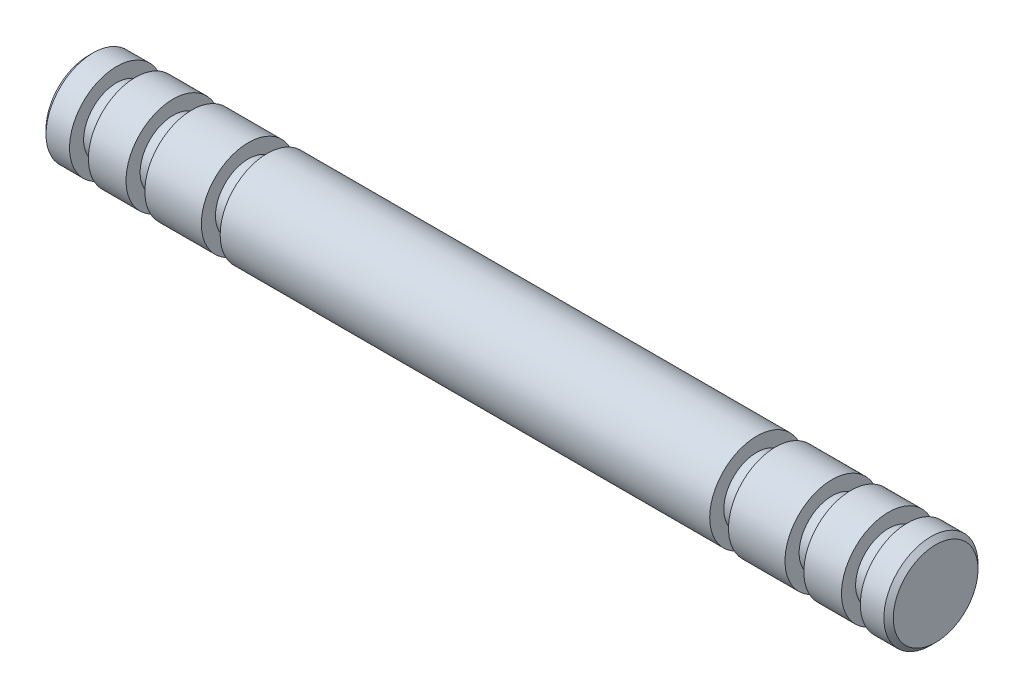
ISO-10303-21;
HEADER;
FILE_DESCRIPTION(('STEP AP214'),'2;1');
FILE_NAME('part.step','',(''),(''),'','','');
FILE_SCHEMA(('AUTOMOTIVE_DESIGN { 1 0 10303 214 1 1 1 1 }'));
ENDSEC;
DATA;
#1=APPLICATION_CONTEXT('core data for automotive mechanical design processes');
#2=APPLICATION_PROTOCOL_DEFINITION('international standard','automotive_design',2000,#1);
#3=PRODUCT_CONTEXT('',#1,'mechanical');
#4=PRODUCT('Part','Part','',(#3));
#5=PRODUCT_RELATED_PRODUCT_CATEGORY('part','',(#4));
#6=PRODUCT_DEFINITION_FORMATION('','',#4);
#7=PRODUCT_DEFINITION_CONTEXT('part definition',#1,'design');
#8=PRODUCT_DEFINITION('design','',#6,#7);
#9=PRODUCT_DEFINITION_SHAPE('','',#8);
#10=(LENGTH_UNIT() NAMED_UNIT(*) SI_UNIT(.MILLI.,.METRE.));
#11=(NAMED_UNIT(*) PLANE_ANGLE_UNIT() SI_UNIT($,.RADIAN.));
#12=(NAMED_UNIT(*) SI_UNIT($,.STERADIAN.) SOLID_ANGLE_UNIT());
#13=UNCERTAINTY_MEASURE_WITH_UNIT(LENGTH_MEASURE(1.E-05),#10,'distance_accuracy_value','');
#14=(GEOMETRIC_REPRESENTATION_CONTEXT(3) GLOBAL_UNCERTAINTY_ASSIGNED_CONTEXT((#13)) GLOBAL_UNIT_ASSIGNED_CONTEXT((#10,
#11,#12)) REPRESENTATION_CONTEXT('',''));
#15=CARTESIAN_POINT('',(0.,0.,0.));
#16=DIRECTION('',(0.,0.,1.));
#17=DIRECTION('',(1.,0.,0.));
#18=AXIS2_PLACEMENT_3D('',#15,#16,#17);
#19=CARTESIAN_POINT('',(-16.,0.,0.));
#20=DIRECTION('',(1.,0.,0.));
#21=DIRECTION('',(0.,0.,-1.));
#22=AXIS2_PLACEMENT_3D('',#19,#20,#21);
#23=CYLINDRICAL_SURFACE('',#22,5.);
#24=CARTESIAN_POINT('',(-18.5,0.,0.));
#25=DIRECTION('',(-1.,0.,0.));
#26=DIRECTION('',(0.,0.,1.));
#27=AXIS2_PLACEMENT_3D('',#24,#25,#26);
#28=CIRCLE('',#27,5.);
#29=CARTESIAN_POINT('',(-18.5,0.,5.));
#30=VERTEX_POINT('',#29);
#31=EDGE_CURVE('E53',#30,#30,#28,.F.);
#32=ORIENTED_EDGE('',*,*,#31,.T.);
#33=EDGE_LOOP('',(#32));
#34=FACE_BOUND('',#33,.T.);
#35=CARTESIAN_POINT('',(-16.,0.,0.));
#36=DIRECTION('',(1.,0.,0.));
#37=DIRECTION('',(0.,0.,-1.));
#38=AXIS2_PLACEMENT_3D('',#35,#36,#37);
#39=CIRCLE('',#38,5.);
#40=CARTESIAN_POINT('',(-16.,0.,-5.));
#41=VERTEX_POINT('',#40);
#42=EDGE_CURVE('E109',#41,#41,#39,.T.);
#43=ORIENTED_EDGE('',*,*,#42,.F.);
#44=EDGE_LOOP('',(#43));
#45=FACE_BOUND('',#44,.T.);
#46=ADVANCED_FACE('F39',(#34,#45),#23,.T.);
#47=CARTESIAN_POINT('',(68.,0.,0.));
#48=DIRECTION('',(-1.,0.,0.));
#49=DIRECTION('',(0.,0.,1.));
#50=AXIS2_PLACEMENT_3D('',#47,#48,#49);
#51=CYLINDRICAL_SURFACE('',#50,5.);
#52=CARTESIAN_POINT('',(70.5,0.,0.));
#53=DIRECTION('',(1.,0.,0.));
#54=DIRECTION('',(0.,0.,-1.));
#55=AXIS2_PLACEMENT_3D('',#52,#53,#54);
#56=CIRCLE('',#55,5.);
#57=CARTESIAN_POINT('',(70.5,0.,-5.));
#58=VERTEX_POINT('',#57);
#59=EDGE_CURVE('E10',#58,#58,#56,.F.);
#60=ORIENTED_EDGE('',*,*,#59,.T.);
#61=EDGE_LOOP('',(#60));
#62=FACE_BOUND('',#61,.T.);
#63=CARTESIAN_POINT('',(68.,0.,0.));
#64=DIRECTION('',(1.,0.,0.));
#65=DIRECTION('',(0.,0.,-1.));
#66=AXIS2_PLACEMENT_3D('',#63,#64,#65);
#67=CIRCLE('',#66,5.);
#68=CARTESIAN_POINT('',(68.,0.,-5.));
#69=VERTEX_POINT('',#68);
#70=EDGE_CURVE('E141',#69,#69,#67,.T.);
#71=ORIENTED_EDGE('',*,*,#70,.T.);
#72=EDGE_LOOP('',(#71));
#73=FACE_BOUND('',#72,.T.);
#74=ADVANCED_FACE('F182',(#62,#73),#51,.T.);
#75=CARTESIAN_POINT('',(52.,0.,0.));
#76=DIRECTION('',(-1.,0.,0.));
#77=DIRECTION('',(0.,0.,1.));
#78=AXIS2_PLACEMENT_3D('',#75,#76,#77);
#79=CYLINDRICAL_SURFACE('',#78,5.);
#80=CARTESIAN_POINT('',(52.,0.,0.));
#81=DIRECTION('',(1.,0.,0.));
#82=DIRECTION('',(0.,0.,-1.));
#83=AXIS2_PLACEMENT_3D('',#80,#81,#82);
#84=CIRCLE('',#83,5.);
#85=CARTESIAN_POINT('',(52.,0.,5.));
#86=VERTEX_POINT('',#85);
#87=EDGE_CURVE('E69',#86,#86,#84,.T.);
#88=CARTESIAN_POINT('',(0.,0.,0.));
#89=DIRECTION('',(1.,0.,0.));
#90=DIRECTION('',(0.,0.,-1.));
#91=AXIS2_PLACEMENT_3D('',#88,#89,#90);
#92=CIRCLE('',#91,5.);
#93=CARTESIAN_POINT('',(0.,0.,5.));
#94=VERTEX_POINT('',#93);
#95=EDGE_CURVE('E65',#94,#94,#92,.T.);
#96=CARTESIAN_POINT('',(52.,0.,5.));
#97=CARTESIAN_POINT('',(51.4583333333333,0.,5.));
#98=CARTESIAN_POINT('',(50.9166666666667,0.,5.));
#99=CARTESIAN_POINT('',(49.8333333333333,0.,5.));
#100=CARTESIAN_POINT('',(49.2916666666667,0.,5.));
#101=CARTESIAN_POINT('',(48.2083333333333,0.,5.));
#102=CARTESIAN_POINT('',(47.6666666666667,0.,5.));
#103=CARTESIAN_POINT('',(46.5833333333333,0.,5.));
#104=CARTESIAN_POINT('',(46.0416666666667,0.,5.));
#105=CARTESIAN_POINT('',(44.9583333333333,0.,5.));
#106=CARTESIAN_POINT('',(44.4166666666667,0.,5.));
#107=CARTESIAN_POINT('',(43.3333333333333,0.,5.));
#108=CARTESIAN_POINT('',(42.7916666666667,0.,5.));
#109=CARTESIAN_POINT('',(41.7083333333333,0.,5.));
#110=CARTESIAN_POINT('',(41.1666666666667,0.,5.));
#111=CARTESIAN_POINT('',(40.0833333333333,0.,5.));
#112=CARTESIAN_POINT('',(39.5416666666667,0.,5.));
#113=CARTESIAN_POINT('',(38.4583333333333,0.,5.));
#114=CARTESIAN_POINT('',(37.9166666666667,0.,5.));
#115=CARTESIAN_POINT('',(36.8333333333333,0.,5.));
#116=CARTESIAN_POINT('',(36.2916666666667,0.,5.));
#117=CARTESIAN_POINT('',(35.2083333333333,0.,5.));
#118=CARTESIAN_POINT('',(34.6666666666667,0.,5.));
#119=CARTESIAN_POINT('',(33.5833333333333,0.,5.));
#120=CARTESIAN_POINT('',(33.0416666666667,0.,5.));
#121=CARTESIAN_POINT('',(31.9583333333333,0.,5.));
#122=CARTESIAN_POINT('',(31.4166666666667,0.,5.));
#123=CARTESIAN_POINT('',(30.3333333333333,0.,5.));
#124=CARTESIAN_POINT('',(29.7916666666667,0.,5.));
#125=CARTESIAN_POINT('',(28.7083333333333,0.,5.));
#126=CARTESIAN_POINT('',(28.1666666666667,0.,5.));
#127=CARTESIAN_POINT('',(27.0833333333333,0.,5.));
#128=CARTESIAN_POINT('',(26.5416666666667,0.,5.));
#129=CARTESIAN_POINT('',(25.4583333333333,0.,5.));
#130=CARTESIAN_POINT('',(24.9166666666667,0.,5.));
#131=CARTESIAN_POINT('',(23.8333333333333,0.,5.));
#132=CARTESIAN_POINT('',(23.2916666666667,0.,5.));
#133=CARTESIAN_POINT('',(22.2083333333333,0.,5.));
#134=CARTESIAN_POINT('',(21.6666666666667,0.,5.));
#135=CARTESIAN_POINT('',(20.5833333333333,0.,5.));
#136=CARTESIAN_POINT('',(20.0416666666667,0.,5.));
#137=CARTESIAN_POINT('',(18.9583333333333,0.,5.));
#138=CARTESIAN_POINT('',(18.4166666666667,0.,5.));
#139=CARTESIAN_POINT('',(17.3333333333333,0.,5.));
#140=CARTESIAN_POINT('',(16.7916666666667,0.,5.));
#141=CARTESIAN_POINT('',(15.7083333333333,0.,5.));
#142=CARTESIAN_POINT('',(15.1666666666667,0.,5.));
#143=CARTESIAN_POINT('',(14.0833333333333,0.,5.));
#144=CARTESIAN_POINT('',(13.5416666666667,0.,5.));
#145=CARTESIAN_POINT('',(12.4583333333333,0.,5.));
#146=CARTESIAN_POINT('',(11.9166666666667,0.,5.));
#147=CARTESIAN_POINT('',(10.8333333333333,0.,5.));
#148=CARTESIAN_POINT('',(10.2916666666667,0.,5.));
#149=CARTESIAN_POINT('',(9.20833333333333,0.,5.));
#150=CARTESIAN_POINT('',(8.66666666666667,0.,5.));
#151=CARTESIAN_POINT('',(7.58333333333333,0.,5.));
#152=CARTESIAN_POINT('',(7.04166666666667,0.,5.));
#153=CARTESIAN_POINT('',(5.95833333333333,0.,5.));
#154=CARTESIAN_POINT('',(5.41666666666667,0.,5.));
#155=CARTESIAN_POINT('',(4.33333333333333,0.,5.));
#156=CARTESIAN_POINT('',(3.79166666666667,0.,5.));
#157=CARTESIAN_POINT('',(2.70833333333334,0.,5.));
#158=CARTESIAN_POINT('',(2.16666666666667,0.,5.));
#159=CARTESIAN_POINT('',(1.08333333333333,0.,5.));
#160=CARTESIAN_POINT('',(0.541666666666667,0.,5.));
#161=CARTESIAN_POINT('',(0.,0.,5.));
#162=B_SPLINE_CURVE_WITH_KNOTS('',3,(#96,#97,#98,#99,#100,#101,#102,#103,#104,#105,#106,#107,
#108,#109,#110,#111,#112,#113,#114,#115,#116,#117,#118,#119,#120,#121,#122,#123,#124,#125,#126,
#127,#128,#129,#130,#131,#132,#133,#134,#135,#136,#137,#138,#139,#140,#141,#142,#143,#144,#145,
#146,#147,#148,#149,#150,#151,#152,#153,#154,#155,#156,#157,#158,#159,#160,#161),.UNSPECIFIED.,
.F.,.F.,(4,2,2,2,2,2,2,2,2,2,2,2,2,2,2,2,2,2,2,2,2,2,2,2,2,2,2,2,2,2,2,2,4),(0.,1.625,3.25,
4.875,6.50000000000001,8.125,9.75,11.375,13.,14.625,16.25,17.875,19.5,21.125,22.75,24.375,26.,
27.625,29.25,30.875,32.5,34.125,35.75,37.375,39.,40.625,42.25,43.875,45.5,47.125,48.75,50.375,
52.),.UNSPECIFIED.);
#163=EDGE_CURVE('BSEAM190',#86,#94,#162,.T.);
#164=ORIENTED_EDGE('',*,*,#87,.F.);
#165=ORIENTED_EDGE('',*,*,#95,.T.);
#166=ORIENTED_EDGE('',*,*,#163,.T.);
#167=ORIENTED_EDGE('',*,*,#163,.F.);
#168=EDGE_LOOP('',(#164,#166,#165,#167));
#169=FACE_BOUND('',#168,.T.);
#170=ADVANCED_FACE('F190',(#169),#79,.T.);
#171=CARTESIAN_POINT('',(52.,0.,0.));
#172=DIRECTION('',(1.,0.,0.));
#173=DIRECTION('',(0.,0.,-1.));
#174=AXIS2_PLACEMENT_3D('',#171,#172,#173);
#175=PLANE('',#174);
#176=CARTESIAN_POINT('',(52.,0.,0.));
#177=DIRECTION('',(1.,0.,0.));
#178=DIRECTION('',(0.,0.,-1.));
#179=AXIS2_PLACEMENT_3D('',#176,#177,#178);
#180=CIRCLE('',#179,3.5);
#181=CARTESIAN_POINT('',(52.,0.,-3.5));
#182=VERTEX_POINT('',#181);
#183=EDGE_CURVE('E74',#182,#182,#180,.T.);
#184=ORIENTED_EDGE('',*,*,#183,.F.);
#185=EDGE_LOOP('',(#184));
#186=FACE_BOUND('',#185,.T.);
#187=ORIENTED_EDGE('',*,*,#87,.T.);
#188=EDGE_LOOP('',(#187));
#189=FACE_BOUND('',#188,.T.);
#190=ADVANCED_FACE('F283',(#186,#189),#175,.T.);
#191=CARTESIAN_POINT('',(0.,0.,0.));
#192=DIRECTION('',(1.,0.,0.));
#193=DIRECTION('',(0.,0.,-1.));
#194=AXIS2_PLACEMENT_3D('',#191,#192,#193);
#195=PLANE('',#194);
#196=CARTESIAN_POINT('',(0.,0.,0.));
#197=DIRECTION('',(-1.,0.,0.));
#198=DIRECTION('',(0.,0.,1.));
#199=AXIS2_PLACEMENT_3D('',#196,#197,#198);
#200=CIRCLE('',#199,3.5);
#201=CARTESIAN_POINT('',(0.,0.,3.5));
#202=VERTEX_POINT('',#201);
#203=EDGE_CURVE('E64',#202,#202,#200,.T.);
#204=ORIENTED_EDGE('',*,*,#203,.F.);
#205=EDGE_LOOP('',(#204));
#206=FACE_BOUND('',#205,.T.);
#207=ORIENTED_EDGE('',*,*,#95,.F.);
#208=EDGE_LOOP('',(#207));
#209=FACE_BOUND('',#208,.T.);
#210=ADVANCED_FACE('F274',(#206,#209),#195,.F.);
#211=CARTESIAN_POINT('',(54.,0.,0.));
#212=DIRECTION('',(-1.,0.,0.));
#213=DIRECTION('',(0.,0.,1.));
#214=AXIS2_PLACEMENT_3D('',#211,#212,#213);
#215=CYLINDRICAL_SURFACE('',#214,3.5);
#216=CARTESIAN_POINT('',(54.,0.,0.));
#217=DIRECTION('',(1.,0.,0.));
#218=DIRECTION('',(0.,0.,-1.));
#219=AXIS2_PLACEMENT_3D('',#216,#217,#218);
#220=CIRCLE('',#219,3.5);
#221=CARTESIAN_POINT('',(54.,0.,-3.5));
#222=VERTEX_POINT('',#221);
#223=EDGE_CURVE('E70',#222,#222,#220,.T.);
#224=ORIENTED_EDGE('',*,*,#223,.F.);
#225=EDGE_LOOP('',(#224));
#226=FACE_BOUND('',#225,.T.);
#227=ORIENTED_EDGE('',*,*,#183,.T.);
#228=EDGE_LOOP('',(#227));
#229=FACE_BOUND('',#228,.T.);
#230=ADVANCED_FACE('F267',(#226,#229),#215,.T.);
#231=CARTESIAN_POINT('',(60.,0.,0.));
#232=DIRECTION('',(1.,0.,0.));
#233=DIRECTION('',(0.,0.,-1.));
#234=AXIS2_PLACEMENT_3D('',#231,#232,#233);
#235=CIRCLE('',#234,5.);
#236=CARTESIAN_POINT('',(60.,0.,-5.));
#237=VERTEX_POINT('',#236);
#238=EDGE_CURVE('E129',#237,#237,#235,.T.);
#239=ORIENTED_EDGE('',*,*,#238,.F.);
#240=EDGE_LOOP('',(#239));
#241=FACE_BOUND('',#240,.T.);
#242=CARTESIAN_POINT('',(54.,0.,0.));
#243=DIRECTION('',(1.,0.,0.));
#244=DIRECTION('',(0.,0.,-1.));
#245=AXIS2_PLACEMENT_3D('',#242,#243,#244);
#246=CIRCLE('',#245,5.);
#247=CARTESIAN_POINT('',(54.,0.,-5.));
#248=VERTEX_POINT('',#247);
#249=EDGE_CURVE('E81',#248,#248,#246,.T.);
#250=ORIENTED_EDGE('',*,*,#249,.T.);
#251=EDGE_LOOP('',(#250));
#252=FACE_BOUND('',#251,.T.);
#253=ADVANCED_FACE('F192',(#241,#252),#51,.T.);
#254=CARTESIAN_POINT('',(54.,0.,0.));
#255=DIRECTION('',(1.,0.,0.));
#256=DIRECTION('',(0.,0.,-1.));
#257=AXIS2_PLACEMENT_3D('',#254,#255,#256);
#258=PLANE('',#257);
#259=ORIENTED_EDGE('',*,*,#223,.T.);
#260=EDGE_LOOP('',(#259));
#261=FACE_BOUND('',#260,.T.);
#262=ORIENTED_EDGE('',*,*,#249,.F.);
#263=EDGE_LOOP('',(#262));
#264=FACE_BOUND('',#263,.T.);
#265=ADVANCED_FACE('F210',(#261,#264),#258,.F.);
#266=CARTESIAN_POINT('',(-2.,0.,0.));
#267=DIRECTION('',(1.,0.,0.));
#268=DIRECTION('',(0.,0.,-1.));
#269=AXIS2_PLACEMENT_3D('',#266,#267,#268);
#270=CYLINDRICAL_SURFACE('',#269,3.5);
#271=CARTESIAN_POINT('',(-2.,0.,0.));
#272=DIRECTION('',(-1.,0.,0.));
#273=DIRECTION('',(0.,0.,1.));
#274=AXIS2_PLACEMENT_3D('',#271,#272,#273);
#275=CIRCLE('',#274,3.5);
#276=CARTESIAN_POINT('',(-2.,0.,3.5));
#277=VERTEX_POINT('',#276);
#278=EDGE_CURVE('E85',#277,#277,#275,.T.);
#279=ORIENTED_EDGE('',*,*,#278,.F.);
#280=EDGE_LOOP('',(#279));
#281=FACE_BOUND('',#280,.T.);
#282=ORIENTED_EDGE('',*,*,#203,.T.);
#283=EDGE_LOOP('',(#282));
#284=FACE_BOUND('',#283,.T.);
#285=ADVANCED_FACE('F202',(#281,#284),#270,.T.);
#286=CARTESIAN_POINT('',(-8.,0.,0.));
#287=DIRECTION('',(1.,0.,0.));
#288=DIRECTION('',(0.,0.,-1.));
#289=AXIS2_PLACEMENT_3D('',#286,#287,#288);
#290=CIRCLE('',#289,5.);
#291=CARTESIAN_POINT('',(-8.,0.,-5.));
#292=VERTEX_POINT('',#291);
#293=EDGE_CURVE('E97',#292,#292,#290,.T.);
#294=ORIENTED_EDGE('',*,*,#293,.T.);
#295=EDGE_LOOP('',(#294));
#296=FACE_BOUND('',#295,.T.);
#297=CARTESIAN_POINT('',(-2.,0.,0.));
#298=DIRECTION('',(-1.,0.,0.));
#299=DIRECTION('',(0.,0.,1.));
#300=AXIS2_PLACEMENT_3D('',#297,#298,#299);
#301=CIRCLE('',#300,5.);
#302=CARTESIAN_POINT('',(-2.,0.,5.));
#303=VERTEX_POINT('',#302);
#304=EDGE_CURVE('E92',#303,#303,#301,.T.);
#305=ORIENTED_EDGE('',*,*,#304,.T.);
#306=EDGE_LOOP('',(#305));
#307=FACE_BOUND('',#306,.T.);
#308=ADVANCED_FACE('F186',(#296,#307),#23,.T.);
#309=CARTESIAN_POINT('',(-2.,0.,0.));
#310=DIRECTION('',(-1.,0.,0.));
#311=DIRECTION('',(0.,0.,1.));
#312=AXIS2_PLACEMENT_3D('',#309,#310,#311);
#313=PLANE('',#312);
#314=ORIENTED_EDGE('',*,*,#278,.T.);
#315=EDGE_LOOP('',(#314));
#316=FACE_BOUND('',#315,.T.);
#317=ORIENTED_EDGE('',*,*,#304,.F.);
#318=EDGE_LOOP('',(#317));
#319=FACE_BOUND('',#318,.T.);
#320=ADVANCED_FACE('F201',(#316,#319),#313,.F.);
#321=CARTESIAN_POINT('',(-10.,0.,0.));
#322=DIRECTION('',(1.,0.,0.));
#323=DIRECTION('',(0.,0.,-1.));
#324=AXIS2_PLACEMENT_3D('',#321,#322,#323);
#325=PLANE('',#324);
#326=CARTESIAN_POINT('',(-10.,0.,0.));
#327=DIRECTION('',(1.,0.,0.));
#328=DIRECTION('',(0.,0.,-1.));
#329=AXIS2_PLACEMENT_3D('',#326,#327,#328);
#330=CIRCLE('',#329,3.5);
#331=CARTESIAN_POINT('',(-10.,0.,-3.5));
#332=VERTEX_POINT('',#331);
#333=EDGE_CURVE('E101',#332,#332,#330,.T.);
#334=ORIENTED_EDGE('',*,*,#333,.F.);
#335=EDGE_LOOP('',(#334));
#336=FACE_BOUND('',#335,.T.);
#337=CARTESIAN_POINT('',(-10.,0.,0.));
#338=DIRECTION('',(1.,0.,0.));
#339=DIRECTION('',(0.,0.,-1.));
#340=AXIS2_PLACEMENT_3D('',#337,#338,#339);
#341=CIRCLE('',#340,5.);
#342=CARTESIAN_POINT('',(-10.,0.,-5.));
#343=VERTEX_POINT('',#342);
#344=EDGE_CURVE('E96',#343,#343,#341,.T.);
#345=ORIENTED_EDGE('',*,*,#344,.T.);
#346=EDGE_LOOP('',(#345));
#347=FACE_BOUND('',#346,.T.);
#348=ADVANCED_FACE('F208',(#336,#347),#325,.T.);
#349=CARTESIAN_POINT('',(-8.,0.,0.));
#350=DIRECTION('',(1.,0.,0.));
#351=DIRECTION('',(0.,0.,-1.));
#352=AXIS2_PLACEMENT_3D('',#349,#350,#351);
#353=PLANE('',#352);
#354=CARTESIAN_POINT('',(-8.,0.,0.));
#355=DIRECTION('',(1.,0.,0.));
#356=DIRECTION('',(0.,0.,-1.));
#357=AXIS2_PLACEMENT_3D('',#354,#355,#356);
#358=CIRCLE('',#357,3.5);
#359=CARTESIAN_POINT('',(-8.,0.,-3.5));
#360=VERTEX_POINT('',#359);
#361=EDGE_CURVE('E105',#360,#360,#358,.T.);
#362=ORIENTED_EDGE('',*,*,#361,.T.);
#363=EDGE_LOOP('',(#362));
#364=FACE_BOUND('',#363,.T.);
#365=ORIENTED_EDGE('',*,*,#293,.F.);
#366=EDGE_LOOP('',(#365));
#367=FACE_BOUND('',#366,.T.);
#368=ADVANCED_FACE('F217',(#364,#367),#353,.F.);
#369=CARTESIAN_POINT('',(-10.,0.,0.));
#370=DIRECTION('',(1.,0.,0.));
#371=DIRECTION('',(0.,0.,-1.));
#372=AXIS2_PLACEMENT_3D('',#369,#370,#371);
#373=CYLINDRICAL_SURFACE('',#372,3.5);
#374=ORIENTED_EDGE('',*,*,#333,.T.);
#375=EDGE_LOOP('',(#374));
#376=FACE_BOUND('',#375,.T.);
#377=ORIENTED_EDGE('',*,*,#361,.F.);
#378=EDGE_LOOP('',(#377));
#379=FACE_BOUND('',#378,.T.);
#380=ADVANCED_FACE('F198',(#376,#379),#373,.T.);
#381=CARTESIAN_POINT('',(-14.,0.,0.));
#382=DIRECTION('',(1.,0.,0.));
#383=DIRECTION('',(0.,0.,-1.));
#384=AXIS2_PLACEMENT_3D('',#381,#382,#383);
#385=CIRCLE('',#384,5.);
#386=CARTESIAN_POINT('',(-14.,0.,-5.));
#387=VERTEX_POINT('',#386);
#388=EDGE_CURVE('E113',#387,#387,#385,.T.);
#389=ORIENTED_EDGE('',*,*,#388,.T.);
#390=EDGE_LOOP('',(#389));
#391=FACE_BOUND('',#390,.T.);
#392=ORIENTED_EDGE('',*,*,#344,.F.);
#393=EDGE_LOOP('',(#392));
#394=FACE_BOUND('',#393,.T.);
#395=ADVANCED_FACE('F185',(#391,#394),#23,.T.);
#396=CARTESIAN_POINT('',(-16.,0.,0.));
#397=DIRECTION('',(1.,0.,0.));
#398=DIRECTION('',(0.,0.,-1.));
#399=AXIS2_PLACEMENT_3D('',#396,#397,#398);
#400=PLANE('',#399);
#401=CARTESIAN_POINT('',(-16.,0.,0.));
#402=DIRECTION('',(1.,0.,0.));
#403=DIRECTION('',(0.,0.,-1.));
#404=AXIS2_PLACEMENT_3D('',#401,#402,#403);
#405=CIRCLE('',#404,3.5);
#406=CARTESIAN_POINT('',(-16.,0.,-3.5));
#407=VERTEX_POINT('',#406);
#408=EDGE_CURVE('E117',#407,#407,#405,.T.);
#409=ORIENTED_EDGE('',*,*,#408,.F.);
#410=EDGE_LOOP('',(#409));
#411=FACE_BOUND('',#410,.T.);
#412=ORIENTED_EDGE('',*,*,#42,.T.);
#413=EDGE_LOOP('',(#412));
#414=FACE_BOUND('',#413,.T.);
#415=ADVANCED_FACE('F197',(#411,#414),#400,.T.);
#416=CARTESIAN_POINT('',(-14.,0.,0.));
#417=DIRECTION('',(1.,0.,0.));
#418=DIRECTION('',(0.,0.,-1.));
#419=AXIS2_PLACEMENT_3D('',#416,#417,#418);
#420=PLANE('',#419);
#421=CARTESIAN_POINT('',(-14.,0.,0.));
#422=DIRECTION('',(1.,0.,0.));
#423=DIRECTION('',(0.,0.,-1.));
#424=AXIS2_PLACEMENT_3D('',#421,#422,#423);
#425=CIRCLE('',#424,3.5);
#426=CARTESIAN_POINT('',(-14.,0.,-3.5));
#427=VERTEX_POINT('',#426);
#428=EDGE_CURVE('E121',#427,#427,#425,.T.);
#429=ORIENTED_EDGE('',*,*,#428,.T.);
#430=EDGE_LOOP('',(#429));
#431=FACE_BOUND('',#430,.T.);
#432=ORIENTED_EDGE('',*,*,#388,.F.);
#433=EDGE_LOOP('',(#432));
#434=FACE_BOUND('',#433,.T.);
#435=ADVANCED_FACE('F230',(#431,#434),#420,.F.);
#436=CARTESIAN_POINT('',(-16.,0.,0.));
#437=DIRECTION('',(1.,0.,0.));
#438=DIRECTION('',(0.,0.,-1.));
#439=AXIS2_PLACEMENT_3D('',#436,#437,#438);
#440=CYLINDRICAL_SURFACE('',#439,3.5);
#441=ORIENTED_EDGE('',*,*,#408,.T.);
#442=EDGE_LOOP('',(#441));
#443=FACE_BOUND('',#442,.T.);
#444=ORIENTED_EDGE('',*,*,#428,.F.);
#445=EDGE_LOOP('',(#444));
#446=FACE_BOUND('',#445,.T.);
#447=ADVANCED_FACE('F233',(#443,#446),#440,.T.);
#448=CARTESIAN_POINT('',(62.,0.,0.));
#449=DIRECTION('',(-1.,0.,0.));
#450=DIRECTION('',(0.,0.,-1.));
#451=AXIS2_PLACEMENT_3D('',#448,#449,#450);
#452=PLANE('',#451);
#453=CARTESIAN_POINT('',(62.,0.,0.));
#454=DIRECTION('',(1.,0.,0.));
#455=DIRECTION('',(0.,0.,-1.));
#456=AXIS2_PLACEMENT_3D('',#453,#454,#455);
#457=CIRCLE('',#456,5.);
#458=CARTESIAN_POINT('',(62.,0.,-5.));
#459=VERTEX_POINT('',#458);
#460=EDGE_CURVE('E125',#459,#459,#457,.T.);
#461=ORIENTED_EDGE('',*,*,#460,.F.);
#462=EDGE_LOOP('',(#461));
#463=FACE_BOUND('',#462,.T.);
#464=CARTESIAN_POINT('',(62.,0.,0.));
#465=DIRECTION('',(1.,0.,0.));
#466=DIRECTION('',(0.,0.,-1.));
#467=AXIS2_PLACEMENT_3D('',#464,#465,#466);
#468=CIRCLE('',#467,3.5);
#469=CARTESIAN_POINT('',(62.,0.,-3.5));
#470=VERTEX_POINT('',#469);
#471=EDGE_CURVE('E133',#470,#470,#468,.T.);
#472=ORIENTED_EDGE('',*,*,#471,.T.);
#473=EDGE_LOOP('',(#472));
#474=FACE_BOUND('',#473,.T.);
#475=ADVANCED_FACE('F240',(#463,#474),#452,.T.);
#476=CARTESIAN_POINT('',(60.,0.,0.));
#477=DIRECTION('',(-1.,0.,0.));
#478=DIRECTION('',(0.,0.,-1.));
#479=AXIS2_PLACEMENT_3D('',#476,#477,#478);
#480=PLANE('',#479);
#481=ORIENTED_EDGE('',*,*,#238,.T.);
#482=EDGE_LOOP('',(#481));
#483=FACE_BOUND('',#482,.T.);
#484=CARTESIAN_POINT('',(60.,0.,0.));
#485=DIRECTION('',(1.,0.,0.));
#486=DIRECTION('',(0.,0.,-1.));
#487=AXIS2_PLACEMENT_3D('',#484,#485,#486);
#488=CIRCLE('',#487,3.5);
#489=CARTESIAN_POINT('',(60.,0.,-3.5));
#490=VERTEX_POINT('',#489);
#491=EDGE_CURVE('E137',#490,#490,#488,.T.);
#492=ORIENTED_EDGE('',*,*,#491,.F.);
#493=EDGE_LOOP('',(#492));
#494=FACE_BOUND('',#493,.T.);
#495=ADVANCED_FACE('F242',(#483,#494),#480,.F.);
#496=CARTESIAN_POINT('',(62.,0.,0.));
#497=DIRECTION('',(-1.,0.,0.));
#498=DIRECTION('',(0.,0.,1.));
#499=AXIS2_PLACEMENT_3D('',#496,#497,#498);
#500=CYLINDRICAL_SURFACE('',#499,3.5);
#501=ORIENTED_EDGE('',*,*,#471,.F.);
#502=EDGE_LOOP('',(#501));
#503=FACE_BOUND('',#502,.T.);
#504=ORIENTED_EDGE('',*,*,#491,.T.);
#505=EDGE_LOOP('',(#504));
#506=FACE_BOUND('',#505,.T.);
#507=ADVANCED_FACE('F245',(#503,#506),#500,.T.);
#508=CARTESIAN_POINT('',(66.,0.,0.));
#509=DIRECTION('',(1.,0.,0.));
#510=DIRECTION('',(0.,0.,-1.));
#511=AXIS2_PLACEMENT_3D('',#508,#509,#510);
#512=CIRCLE('',#511,5.);
#513=CARTESIAN_POINT('',(66.,0.,-5.));
#514=VERTEX_POINT('',#513);
#515=EDGE_CURVE('E145',#514,#514,#512,.T.);
#516=ORIENTED_EDGE('',*,*,#515,.F.);
#517=EDGE_LOOP('',(#516));
#518=FACE_BOUND('',#517,.T.);
#519=ORIENTED_EDGE('',*,*,#460,.T.);
#520=EDGE_LOOP('',(#519));
#521=FACE_BOUND('',#520,.T.);
#522=ADVANCED_FACE('F177',(#518,#521),#51,.T.);
#523=CARTESIAN_POINT('',(68.,0.,0.));
#524=DIRECTION('',(-1.,0.,0.));
#525=DIRECTION('',(0.,0.,-1.));
#526=AXIS2_PLACEMENT_3D('',#523,#524,#525);
#527=PLANE('',#526);
#528=ORIENTED_EDGE('',*,*,#70,.F.);
#529=EDGE_LOOP('',(#528));
#530=FACE_BOUND('',#529,.T.);
#531=CARTESIAN_POINT('',(68.,0.,0.));
#532=DIRECTION('',(1.,0.,0.));
#533=DIRECTION('',(0.,0.,-1.));
#534=AXIS2_PLACEMENT_3D('',#531,#532,#533);
#535=CIRCLE('',#534,3.5);
#536=CARTESIAN_POINT('',(68.,0.,-3.5));
#537=VERTEX_POINT('',#536);
#538=EDGE_CURVE('E149',#537,#537,#535,.T.);
#539=ORIENTED_EDGE('',*,*,#538,.T.);
#540=EDGE_LOOP('',(#539));
#541=FACE_BOUND('',#540,.T.);
#542=ADVANCED_FACE('F161',(#530,#541),#527,.T.);
#543=CARTESIAN_POINT('',(66.,0.,0.));
#544=DIRECTION('',(-1.,0.,0.));
#545=DIRECTION('',(0.,0.,-1.));
#546=AXIS2_PLACEMENT_3D('',#543,#544,#545);
#547=PLANE('',#546);
#548=ORIENTED_EDGE('',*,*,#515,.T.);
#549=EDGE_LOOP('',(#548));
#550=FACE_BOUND('',#549,.T.);
#551=CARTESIAN_POINT('',(66.,0.,0.));
#552=DIRECTION('',(1.,0.,0.));
#553=DIRECTION('',(0.,0.,-1.));
#554=AXIS2_PLACEMENT_3D('',#551,#552,#553);
#555=CIRCLE('',#554,3.5);
#556=CARTESIAN_POINT('',(66.,0.,-3.5));
#557=VERTEX_POINT('',#556);
#558=EDGE_CURVE('E153',#557,#557,#555,.T.);
#559=ORIENTED_EDGE('',*,*,#558,.F.);
#560=EDGE_LOOP('',(#559));
#561=FACE_BOUND('',#560,.T.);
#562=ADVANCED_FACE('F167',(#550,#561),#547,.F.);
#563=CARTESIAN_POINT('',(68.,0.,0.));
#564=DIRECTION('',(-1.,0.,0.));
#565=DIRECTION('',(0.,0.,1.));
#566=AXIS2_PLACEMENT_3D('',#563,#564,#565);
#567=CYLINDRICAL_SURFACE('',#566,3.5);
#568=ORIENTED_EDGE('',*,*,#538,.F.);
#569=EDGE_LOOP('',(#568));
#570=FACE_BOUND('',#569,.T.);
#571=ORIENTED_EDGE('',*,*,#558,.T.);
#572=EDGE_LOOP('',(#571));
#573=FACE_BOUND('',#572,.T.);
#574=ADVANCED_FACE('F163',(#570,#573),#567,.T.);
#575=CARTESIAN_POINT('',(71.,0.,0.));
#576=DIRECTION('',(1.,0.,0.));
#577=DIRECTION('',(0.,0.,-1.));
#578=AXIS2_PLACEMENT_3D('',#575,#576,#577);
#579=PLANE('',#578);
#580=CARTESIAN_POINT('',(71.,0.,0.));
#581=DIRECTION('',(1.,0.,0.));
#582=DIRECTION('',(0.,0.,-1.));
#583=AXIS2_PLACEMENT_3D('',#580,#581,#582);
#584=CIRCLE('',#583,4.50000000000002);
#585=CARTESIAN_POINT('',(71.,0.,-4.50000000000002));
#586=VERTEX_POINT('',#585);
#587=EDGE_CURVE('E48',#586,#586,#584,.T.);
#588=ORIENTED_EDGE('',*,*,#587,.T.);
#589=EDGE_LOOP('',(#588));
#590=FACE_BOUND('',#589,.T.);
#591=ADVANCED_FACE('F166',(#590),#579,.T.);
#592=CARTESIAN_POINT('',(-19.,0.,0.));
#593=DIRECTION('',(-1.,0.,0.));
#594=DIRECTION('',(0.,0.,1.));
#595=AXIS2_PLACEMENT_3D('',#592,#593,#594);
#596=PLANE('',#595);
#597=CARTESIAN_POINT('',(-19.,0.,0.));
#598=DIRECTION('',(-1.,0.,0.));
#599=DIRECTION('',(0.,0.,1.));
#600=AXIS2_PLACEMENT_3D('',#597,#598,#599);
#601=CIRCLE('',#600,4.50000000000002);
#602=CARTESIAN_POINT('',(-19.,0.,4.50000000000002));
#603=VERTEX_POINT('',#602);
#604=EDGE_CURVE('E58',#603,#603,#601,.T.);
#605=ORIENTED_EDGE('',*,*,#604,.T.);
#606=EDGE_LOOP('',(#605));
#607=FACE_BOUND('',#606,.T.);
#608=ADVANCED_FACE('F299',(#607),#596,.T.);
#609=CARTESIAN_POINT('',(-19.,0.,0.));
#610=DIRECTION('',(1.,0.,0.));
#611=DIRECTION('',(0.,0.,-1.));
#612=AXIS2_PLACEMENT_3D('',#609,#610,#611);
#613=CONICAL_SURFACE('',#612,4.50000000000002,0.785398163397444);
#614=ORIENTED_EDGE('',*,*,#31,.F.);
#615=EDGE_LOOP('',(#614));
#616=FACE_BOUND('',#615,.T.);
#617=ORIENTED_EDGE('',*,*,#604,.F.);
#618=EDGE_LOOP('',(#617));
#619=FACE_BOUND('',#618,.T.);
#620=ADVANCED_FACE('F295',(#616,#619),#613,.T.);
#621=CARTESIAN_POINT('',(71.,0.,0.));
#622=DIRECTION('',(-1.,0.,0.));
#623=DIRECTION('',(0.,0.,1.));
#624=AXIS2_PLACEMENT_3D('',#621,#622,#623);
#625=CONICAL_SURFACE('',#624,4.50000000000002,0.785398163397444);
#626=ORIENTED_EDGE('',*,*,#59,.F.);
#627=EDGE_LOOP('',(#626));
#628=FACE_BOUND('',#627,.T.);
#629=ORIENTED_EDGE('',*,*,#587,.F.);
#630=EDGE_LOOP('',(#629));
#631=FACE_BOUND('',#630,.T.);
#632=ADVANCED_FACE('F42',(#628,#631),#625,.T.);
#633=CLOSED_SHELL('',(#46,#74,#170,#190,#210,#230,#253,#265,#285,#308,#320,#348,#368,#380,#395,
#415,#435,#447,#475,#495,#507,#522,#542,#562,#574,#591,#608,#620,#632));
#634=MANIFOLD_SOLID_BREP('B2',#633);
#635=ADVANCED_BREP_SHAPE_REPRESENTATION('',(#18,#634),#14);
#636=SHAPE_DEFINITION_REPRESENTATION(#9,#635);
ENDSEC;
END-ISO-10303-21;
